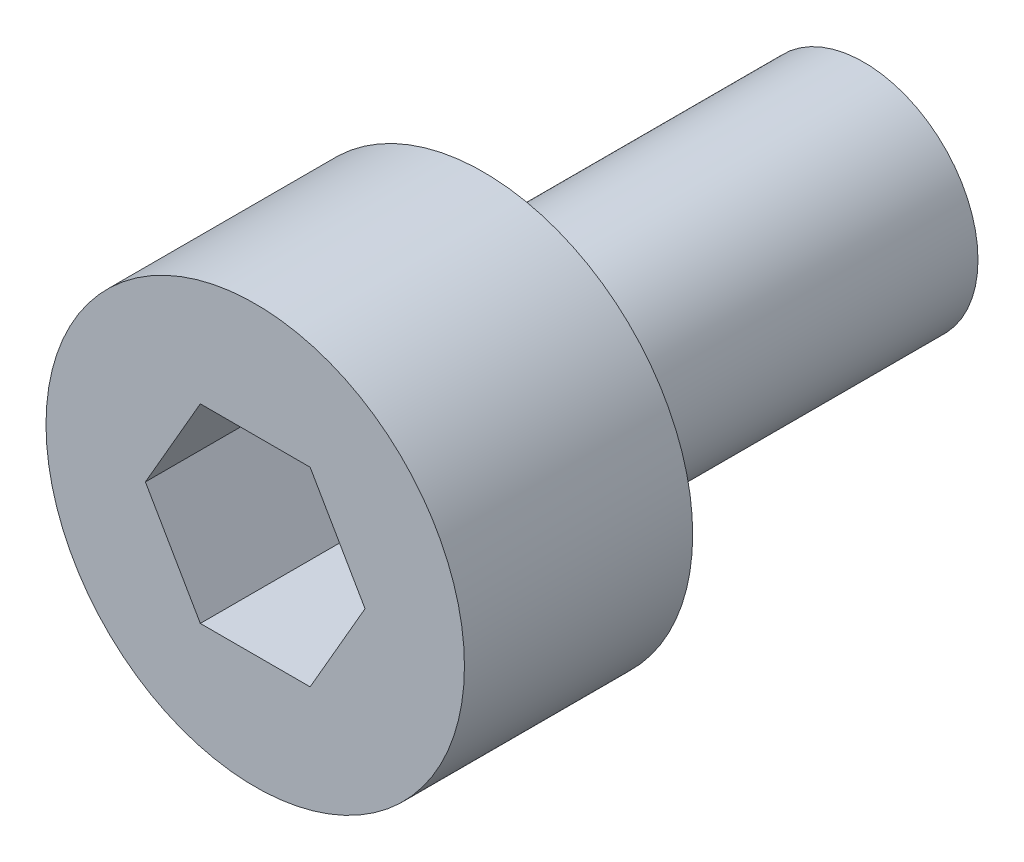
ISO-10303-21;
HEADER;
FILE_DESCRIPTION(('STEP AP214'),'2;1');
FILE_NAME('part.step','',(''),(''),'','','');
FILE_SCHEMA(('AUTOMOTIVE_DESIGN { 1 0 10303 214 1 1 1 1 }'));
ENDSEC;
DATA;
#1=APPLICATION_CONTEXT('core data for automotive mechanical design processes');
#2=APPLICATION_PROTOCOL_DEFINITION('international standard','automotive_design',2000,#1);
#3=PRODUCT_CONTEXT('',#1,'mechanical');
#4=PRODUCT('Part','Part','',(#3));
#5=PRODUCT_RELATED_PRODUCT_CATEGORY('part','',(#4));
#6=PRODUCT_DEFINITION_FORMATION('','',#4);
#7=PRODUCT_DEFINITION_CONTEXT('part definition',#1,'design');
#8=PRODUCT_DEFINITION('design','',#6,#7);
#9=PRODUCT_DEFINITION_SHAPE('','',#8);
#10=(LENGTH_UNIT() NAMED_UNIT(*) SI_UNIT(.MILLI.,.METRE.));
#11=(NAMED_UNIT(*) PLANE_ANGLE_UNIT() SI_UNIT($,.RADIAN.));
#12=(NAMED_UNIT(*) SI_UNIT($,.STERADIAN.) SOLID_ANGLE_UNIT());
#13=UNCERTAINTY_MEASURE_WITH_UNIT(LENGTH_MEASURE(1.E-05),#10,'distance_accuracy_value','');
#14=(GEOMETRIC_REPRESENTATION_CONTEXT(3) GLOBAL_UNCERTAINTY_ASSIGNED_CONTEXT((#13)) GLOBAL_UNIT_ASSIGNED_CONTEXT((#10,
#11,#12)) REPRESENTATION_CONTEXT('',''));
#15=CARTESIAN_POINT('',(0.,0.,0.));
#16=DIRECTION('',(0.,0.,1.));
#17=DIRECTION('',(1.,0.,0.));
#18=AXIS2_PLACEMENT_3D('',#15,#16,#17);
#19=CARTESIAN_POINT('',(0.,0.,5.));
#20=DIRECTION('',(0.,0.,-1.));
#21=DIRECTION('',(-1.,0.,0.));
#22=AXIS2_PLACEMENT_3D('',#19,#20,#21);
#23=CYLINDRICAL_SURFACE('',#22,1.5);
#24=CARTESIAN_POINT('',(0.,0.,5.));
#25=DIRECTION('',(0.,0.,1.));
#26=DIRECTION('',(1.,0.,0.));
#27=AXIS2_PLACEMENT_3D('',#24,#25,#26);
#28=CIRCLE('',#27,1.5);
#29=CARTESIAN_POINT('',(1.5,0.,5.));
#30=VERTEX_POINT('',#29);
#31=EDGE_CURVE('E11',#30,#30,#28,.T.);
#32=ORIENTED_EDGE('',*,*,#31,.F.);
#33=EDGE_LOOP('',(#32));
#34=FACE_BOUND('',#33,.T.);
#35=CARTESIAN_POINT('',(0.,0.,0.));
#36=DIRECTION('',(0.,0.,1.));
#37=DIRECTION('',(1.,0.,0.));
#38=AXIS2_PLACEMENT_3D('',#35,#36,#37);
#39=CIRCLE('',#38,1.5);
#40=CARTESIAN_POINT('',(1.5,0.,0.));
#41=VERTEX_POINT('',#40);
#42=EDGE_CURVE('E37',#41,#41,#39,.T.);
#43=ORIENTED_EDGE('',*,*,#42,.T.);
#44=EDGE_LOOP('',(#43));
#45=FACE_BOUND('',#44,.T.);
#46=ADVANCED_FACE('F34',(#34,#45),#23,.T.);
#47=CARTESIAN_POINT('',(0.,0.,0.));
#48=DIRECTION('',(0.,0.,1.));
#49=DIRECTION('',(1.,0.,0.));
#50=AXIS2_PLACEMENT_3D('',#47,#48,#49);
#51=PLANE('',#50);
#52=ORIENTED_EDGE('',*,*,#42,.F.);
#53=EDGE_LOOP('',(#52));
#54=FACE_BOUND('',#53,.T.);
#55=ADVANCED_FACE('F165',(#54),#51,.F.);
#56=CARTESIAN_POINT('',(0.,0.,8.));
#57=DIRECTION('',(0.,0.,-1.));
#58=DIRECTION('',(-1.,0.,0.));
#59=AXIS2_PLACEMENT_3D('',#56,#57,#58);
#60=CYLINDRICAL_SURFACE('',#59,2.75);
#61=CARTESIAN_POINT('',(0.,0.,8.));
#62=DIRECTION('',(0.,0.,1.));
#63=DIRECTION('',(1.,0.,0.));
#64=AXIS2_PLACEMENT_3D('',#61,#62,#63);
#65=CIRCLE('',#64,2.75);
#66=CARTESIAN_POINT('',(2.75,0.,8.));
#67=VERTEX_POINT('',#66);
#68=EDGE_CURVE('E141',#67,#67,#65,.T.);
#69=ORIENTED_EDGE('',*,*,#68,.F.);
#70=EDGE_LOOP('',(#69));
#71=FACE_BOUND('',#70,.T.);
#72=CARTESIAN_POINT('',(0.,0.,5.));
#73=DIRECTION('',(0.,0.,1.));
#74=DIRECTION('',(1.,0.,0.));
#75=AXIS2_PLACEMENT_3D('',#72,#73,#74);
#76=CIRCLE('',#75,2.75);
#77=CARTESIAN_POINT('',(2.75,0.,5.));
#78=VERTEX_POINT('',#77);
#79=EDGE_CURVE('E135',#78,#78,#76,.T.);
#80=ORIENTED_EDGE('',*,*,#79,.T.);
#81=EDGE_LOOP('',(#80));
#82=FACE_BOUND('',#81,.T.);
#83=ADVANCED_FACE('F147',(#71,#82),#60,.T.);
#84=CARTESIAN_POINT('',(0.,0.,8.));
#85=DIRECTION('',(0.,0.,1.));
#86=DIRECTION('',(1.,0.,0.));
#87=AXIS2_PLACEMENT_3D('',#84,#85,#86);
#88=PLANE('',#87);
#89=DIRECTION('',(0.5,0.866025403784439,0.));
#90=VECTOR('',#89,1.);
#91=CARTESIAN_POINT('',(0.721687836487032,-1.25,8.));
#92=LINE('',#91,#90);
#93=CARTESIAN_POINT('',(0.721687836487032,-1.25,8.));
#94=VERTEX_POINT('',#93);
#95=CARTESIAN_POINT('',(1.44337567297406,0.,8.));
#96=VERTEX_POINT('',#95);
#97=EDGE_CURVE('E48',#94,#96,#92,.T.);
#98=ORIENTED_EDGE('',*,*,#97,.F.);
#99=DIRECTION('',(1.,0.,0.));
#100=VECTOR('',#99,1.);
#101=CARTESIAN_POINT('',(-0.721687836487033,-1.25,8.));
#102=LINE('',#101,#100);
#103=CARTESIAN_POINT('',(-0.721687836487033,-1.25,8.));
#104=VERTEX_POINT('',#103);
#105=EDGE_CURVE('E131',#104,#94,#102,.T.);
#106=ORIENTED_EDGE('',*,*,#105,.F.);
#107=DIRECTION('',(0.5,-0.866025403784439,0.));
#108=VECTOR('',#107,1.);
#109=CARTESIAN_POINT('',(-1.44337567297407,0.,8.));
#110=LINE('',#109,#108);
#111=CARTESIAN_POINT('',(-1.44337567297407,0.,8.));
#112=VERTEX_POINT('',#111);
#113=EDGE_CURVE('E129',#112,#104,#110,.T.);
#114=ORIENTED_EDGE('',*,*,#113,.F.);
#115=DIRECTION('',(-0.5,-0.866025403784439,0.));
#116=VECTOR('',#115,1.);
#117=CARTESIAN_POINT('',(-0.721687836487033,1.25,8.));
#118=LINE('',#117,#116);
#119=CARTESIAN_POINT('',(-0.721687836487033,1.25,8.));
#120=VERTEX_POINT('',#119);
#121=EDGE_CURVE('E96',#120,#112,#118,.T.);
#122=ORIENTED_EDGE('',*,*,#121,.F.);
#123=DIRECTION('',(-1.,0.,0.));
#124=VECTOR('',#123,1.);
#125=CARTESIAN_POINT('',(0.721687836487032,1.25,8.));
#126=LINE('',#125,#124);
#127=CARTESIAN_POINT('',(0.721687836487032,1.25,8.));
#128=VERTEX_POINT('',#127);
#129=EDGE_CURVE('E125',#128,#120,#126,.T.);
#130=ORIENTED_EDGE('',*,*,#129,.F.);
#131=DIRECTION('',(-0.5,0.866025403784439,0.));
#132=VECTOR('',#131,1.);
#133=CARTESIAN_POINT('',(1.44337567297406,0.,8.));
#134=LINE('',#133,#132);
#135=EDGE_CURVE('E122',#96,#128,#134,.T.);
#136=ORIENTED_EDGE('',*,*,#135,.F.);
#137=EDGE_LOOP('',(#98,#106,#114,#122,#130,#136));
#138=FACE_BOUND('',#137,.T.);
#139=ORIENTED_EDGE('',*,*,#68,.T.);
#140=EDGE_LOOP('',(#139));
#141=FACE_BOUND('',#140,.T.);
#142=ADVANCED_FACE('F152',(#138,#141),#88,.T.);
#143=CARTESIAN_POINT('',(0.,0.,5.));
#144=DIRECTION('',(0.,0.,1.));
#145=DIRECTION('',(1.,0.,0.));
#146=AXIS2_PLACEMENT_3D('',#143,#144,#145);
#147=PLANE('',#146);
#148=ORIENTED_EDGE('',*,*,#31,.T.);
#149=EDGE_LOOP('',(#148));
#150=FACE_BOUND('',#149,.T.);
#151=ORIENTED_EDGE('',*,*,#79,.F.);
#152=EDGE_LOOP('',(#151));
#153=FACE_BOUND('',#152,.T.);
#154=ADVANCED_FACE('F149',(#150,#153),#147,.F.);
#155=CARTESIAN_POINT('',(0.721687836487032,-1.25,6.));
#156=DIRECTION('',(0.866025403784439,-0.5,0.));
#157=DIRECTION('',(0.5,0.866025403784439,0.));
#158=AXIS2_PLACEMENT_3D('',#155,#156,#157);
#159=PLANE('',#158);
#160=ORIENTED_EDGE('',*,*,#97,.T.);
#161=DIRECTION('',(0.,0.,1.));
#162=VECTOR('',#161,1.);
#163=CARTESIAN_POINT('',(1.44337567297406,0.,6.));
#164=LINE('',#163,#162);
#165=CARTESIAN_POINT('',(1.44337567297406,0.,6.));
#166=VERTEX_POINT('',#165);
#167=EDGE_CURVE('E78',#166,#96,#164,.T.);
#168=ORIENTED_EDGE('',*,*,#167,.F.);
#169=DIRECTION('',(0.5,0.866025403784439,0.));
#170=VECTOR('',#169,1.);
#171=CARTESIAN_POINT('',(0.721687836487032,-1.25,6.));
#172=LINE('',#171,#170);
#173=CARTESIAN_POINT('',(0.721687836487032,-1.25,6.));
#174=VERTEX_POINT('',#173);
#175=EDGE_CURVE('E133',#174,#166,#172,.T.);
#176=ORIENTED_EDGE('',*,*,#175,.F.);
#177=DIRECTION('',(0.,0.,1.));
#178=VECTOR('',#177,1.);
#179=CARTESIAN_POINT('',(0.721687836487032,-1.25,6.));
#180=LINE('',#179,#178);
#181=EDGE_CURVE('E56',#174,#94,#180,.T.);
#182=ORIENTED_EDGE('',*,*,#181,.T.);
#183=EDGE_LOOP('',(#160,#168,#176,#182));
#184=FACE_BOUND('',#183,.T.);
#185=ADVANCED_FACE('F151',(#184),#159,.F.);
#186=CARTESIAN_POINT('',(-0.721687836487033,-1.25,6.));
#187=DIRECTION('',(0.,-1.,0.));
#188=DIRECTION('',(1.,0.,0.));
#189=AXIS2_PLACEMENT_3D('',#186,#187,#188);
#190=PLANE('',#189);
#191=ORIENTED_EDGE('',*,*,#105,.T.);
#192=ORIENTED_EDGE('',*,*,#181,.F.);
#193=DIRECTION('',(1.,0.,0.));
#194=VECTOR('',#193,1.);
#195=CARTESIAN_POINT('',(-0.721687836487033,-1.25,6.));
#196=LINE('',#195,#194);
#197=CARTESIAN_POINT('',(-0.721687836487033,-1.25,6.));
#198=VERTEX_POINT('',#197);
#199=EDGE_CURVE('E108',#198,#174,#196,.T.);
#200=ORIENTED_EDGE('',*,*,#199,.F.);
#201=DIRECTION('',(0.,0.,1.));
#202=VECTOR('',#201,1.);
#203=CARTESIAN_POINT('',(-0.721687836487033,-1.25,6.));
#204=LINE('',#203,#202);
#205=EDGE_CURVE('E100',#198,#104,#204,.T.);
#206=ORIENTED_EDGE('',*,*,#205,.T.);
#207=EDGE_LOOP('',(#191,#192,#200,#206));
#208=FACE_BOUND('',#207,.T.);
#209=ADVANCED_FACE('F159',(#208),#190,.F.);
#210=CARTESIAN_POINT('',(-1.44337567297407,0.,6.));
#211=DIRECTION('',(-0.866025403784439,-0.5,0.));
#212=DIRECTION('',(0.5,-0.866025403784439,0.));
#213=AXIS2_PLACEMENT_3D('',#210,#211,#212);
#214=PLANE('',#213);
#215=ORIENTED_EDGE('',*,*,#113,.T.);
#216=ORIENTED_EDGE('',*,*,#205,.F.);
#217=DIRECTION('',(0.5,-0.866025403784439,0.));
#218=VECTOR('',#217,1.);
#219=CARTESIAN_POINT('',(-1.44337567297407,0.,6.));
#220=LINE('',#219,#218);
#221=CARTESIAN_POINT('',(-1.44337567297407,0.,6.));
#222=VERTEX_POINT('',#221);
#223=EDGE_CURVE('E104',#222,#198,#220,.T.);
#224=ORIENTED_EDGE('',*,*,#223,.F.);
#225=DIRECTION('',(0.,0.,1.));
#226=VECTOR('',#225,1.);
#227=CARTESIAN_POINT('',(-1.44337567297407,0.,6.));
#228=LINE('',#227,#226);
#229=EDGE_CURVE('E89',#222,#112,#228,.T.);
#230=ORIENTED_EDGE('',*,*,#229,.T.);
#231=EDGE_LOOP('',(#215,#216,#224,#230));
#232=FACE_BOUND('',#231,.T.);
#233=ADVANCED_FACE('F105',(#232),#214,.F.);
#234=CARTESIAN_POINT('',(-0.721687836487033,1.25,6.));
#235=DIRECTION('',(-0.866025403784439,0.5,0.));
#236=DIRECTION('',(-0.5,-0.866025403784439,0.));
#237=AXIS2_PLACEMENT_3D('',#234,#235,#236);
#238=PLANE('',#237);
#239=ORIENTED_EDGE('',*,*,#121,.T.);
#240=ORIENTED_EDGE('',*,*,#229,.F.);
#241=DIRECTION('',(-0.5,-0.866025403784439,0.));
#242=VECTOR('',#241,1.);
#243=CARTESIAN_POINT('',(-0.721687836487033,1.25,6.));
#244=LINE('',#243,#242);
#245=CARTESIAN_POINT('',(-0.721687836487033,1.25,6.));
#246=VERTEX_POINT('',#245);
#247=EDGE_CURVE('E93',#246,#222,#244,.T.);
#248=ORIENTED_EDGE('',*,*,#247,.F.);
#249=DIRECTION('',(0.,0.,1.));
#250=VECTOR('',#249,1.);
#251=CARTESIAN_POINT('',(-0.721687836487033,1.25,6.));
#252=LINE('',#251,#250);
#253=EDGE_CURVE('E101',#246,#120,#252,.T.);
#254=ORIENTED_EDGE('',*,*,#253,.T.);
#255=EDGE_LOOP('',(#239,#240,#248,#254));
#256=FACE_BOUND('',#255,.T.);
#257=ADVANCED_FACE('F91',(#256),#238,.F.);
#258=CARTESIAN_POINT('',(0.721687836487032,1.25,6.));
#259=DIRECTION('',(0.,1.,0.));
#260=DIRECTION('',(0.,0.,1.));
#261=AXIS2_PLACEMENT_3D('',#258,#259,#260);
#262=PLANE('',#261);
#263=ORIENTED_EDGE('',*,*,#129,.T.);
#264=ORIENTED_EDGE('',*,*,#253,.F.);
#265=DIRECTION('',(-1.,0.,0.));
#266=VECTOR('',#265,1.);
#267=CARTESIAN_POINT('',(0.721687836487032,1.25,6.));
#268=LINE('',#267,#266);
#269=CARTESIAN_POINT('',(0.721687836487032,1.25,6.));
#270=VERTEX_POINT('',#269);
#271=EDGE_CURVE('E114',#270,#246,#268,.T.);
#272=ORIENTED_EDGE('',*,*,#271,.F.);
#273=DIRECTION('',(0.,0.,1.));
#274=VECTOR('',#273,1.);
#275=CARTESIAN_POINT('',(0.721687836487032,1.25,6.));
#276=LINE('',#275,#274);
#277=EDGE_CURVE('E138',#270,#128,#276,.T.);
#278=ORIENTED_EDGE('',*,*,#277,.T.);
#279=EDGE_LOOP('',(#263,#264,#272,#278));
#280=FACE_BOUND('',#279,.T.);
#281=ADVANCED_FACE('F220',(#280),#262,.F.);
#282=CARTESIAN_POINT('',(1.44337567297406,0.,6.));
#283=DIRECTION('',(0.866025403784439,0.5,0.));
#284=DIRECTION('',(-0.5,0.866025403784439,0.));
#285=AXIS2_PLACEMENT_3D('',#282,#283,#284);
#286=PLANE('',#285);
#287=ORIENTED_EDGE('',*,*,#135,.T.);
#288=ORIENTED_EDGE('',*,*,#277,.F.);
#289=DIRECTION('',(-0.5,0.866025403784439,0.));
#290=VECTOR('',#289,1.);
#291=CARTESIAN_POINT('',(1.44337567297406,0.,6.));
#292=LINE('',#291,#290);
#293=EDGE_CURVE('E116',#166,#270,#292,.T.);
#294=ORIENTED_EDGE('',*,*,#293,.F.);
#295=ORIENTED_EDGE('',*,*,#167,.T.);
#296=EDGE_LOOP('',(#287,#288,#294,#295));
#297=FACE_BOUND('',#296,.T.);
#298=ADVANCED_FACE('F229',(#297),#286,.F.);
#299=CARTESIAN_POINT('',(0.,0.,6.));
#300=DIRECTION('',(0.,0.,1.));
#301=DIRECTION('',(1.,0.,0.));
#302=AXIS2_PLACEMENT_3D('',#299,#300,#301);
#303=PLANE('',#302);
#304=ORIENTED_EDGE('',*,*,#175,.T.);
#305=ORIENTED_EDGE('',*,*,#293,.T.);
#306=ORIENTED_EDGE('',*,*,#271,.T.);
#307=ORIENTED_EDGE('',*,*,#247,.T.);
#308=ORIENTED_EDGE('',*,*,#223,.T.);
#309=ORIENTED_EDGE('',*,*,#199,.T.);
#310=EDGE_LOOP('',(#304,#305,#306,#307,#308,#309));
#311=FACE_BOUND('',#310,.T.);
#312=ADVANCED_FACE('F111',(#311),#303,.T.);
#313=CLOSED_SHELL('',(#46,#55,#83,#142,#154,#185,#209,#233,#257,#281,#298,#312));
#314=MANIFOLD_SOLID_BREP('B2',#313);
#315=ADVANCED_BREP_SHAPE_REPRESENTATION('',(#18,#314),#14);
#316=SHAPE_DEFINITION_REPRESENTATION(#9,#315);
ENDSEC;
END-ISO-10303-21;
